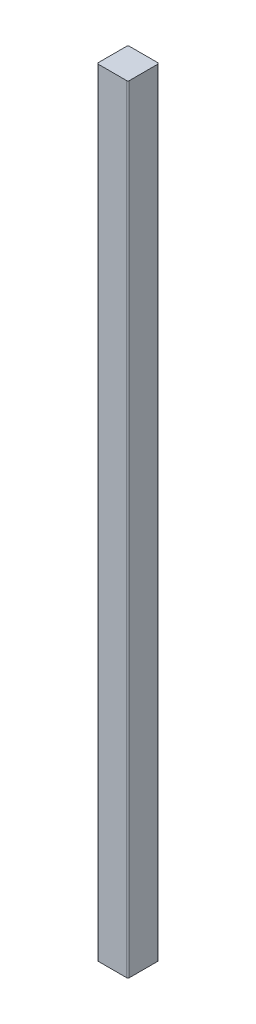
ISO-10303-21;
HEADER;
FILE_DESCRIPTION(('STEP AP214'),'2;1');
FILE_NAME('part.step','',(''),(''),'','','');
FILE_SCHEMA(('AUTOMOTIVE_DESIGN { 1 0 10303 214 1 1 1 1 }'));
ENDSEC;
DATA;
#1=APPLICATION_CONTEXT('core data for automotive mechanical design processes');
#2=APPLICATION_PROTOCOL_DEFINITION('international standard','automotive_design',2000,#1);
#3=PRODUCT_CONTEXT('',#1,'mechanical');
#4=PRODUCT('Part','Part','',(#3));
#5=PRODUCT_RELATED_PRODUCT_CATEGORY('part','',(#4));
#6=PRODUCT_DEFINITION_FORMATION('','',#4);
#7=PRODUCT_DEFINITION_CONTEXT('part definition',#1,'design');
#8=PRODUCT_DEFINITION('design','',#6,#7);
#9=PRODUCT_DEFINITION_SHAPE('','',#8);
#10=(LENGTH_UNIT() NAMED_UNIT(*) SI_UNIT(.MILLI.,.METRE.));
#11=(NAMED_UNIT(*) PLANE_ANGLE_UNIT() SI_UNIT($,.RADIAN.));
#12=(NAMED_UNIT(*) SI_UNIT($,.STERADIAN.) SOLID_ANGLE_UNIT());
#13=UNCERTAINTY_MEASURE_WITH_UNIT(LENGTH_MEASURE(1.E-05),#10,'distance_accuracy_value','');
#14=(GEOMETRIC_REPRESENTATION_CONTEXT(3) GLOBAL_UNCERTAINTY_ASSIGNED_CONTEXT((#13)) GLOBAL_UNIT_ASSIGNED_CONTEXT((#10,
#11,#12)) REPRESENTATION_CONTEXT('',''));
#15=CARTESIAN_POINT('',(0.,0.,0.));
#16=DIRECTION('',(0.,0.,1.));
#17=DIRECTION('',(1.,0.,0.));
#18=AXIS2_PLACEMENT_3D('',#15,#16,#17);
#19=CARTESIAN_POINT('',(-18.,1000.,18.));
#20=DIRECTION('',(0.,-1.,0.));
#21=DIRECTION('',(0.,0.,-1.));
#22=AXIS2_PLACEMENT_3D('',#19,#20,#21);
#23=CYLINDRICAL_SURFACE('',#22,2.);
#24=CARTESIAN_POINT('',(-18.,0.,18.));
#25=DIRECTION('',(0.,1.,0.));
#26=DIRECTION('',(0.,0.,1.));
#27=AXIS2_PLACEMENT_3D('',#24,#25,#26);
#28=CIRCLE('',#27,2.);
#29=CARTESIAN_POINT('',(-20.,0.,18.));
#30=VERTEX_POINT('',#29);
#31=CARTESIAN_POINT('',(-18.,0.,20.));
#32=VERTEX_POINT('',#31);
#33=EDGE_CURVE('E140',#30,#32,#28,.T.);
#34=ORIENTED_EDGE('',*,*,#33,.T.);
#35=DIRECTION('',(0.,-1.,0.));
#36=VECTOR('',#35,1.);
#37=CARTESIAN_POINT('',(-18.,1000.,20.));
#38=LINE('',#37,#36);
#39=CARTESIAN_POINT('',(-18.,1000.,20.));
#40=VERTEX_POINT('',#39);
#41=EDGE_CURVE('E11',#40,#32,#38,.T.);
#42=ORIENTED_EDGE('',*,*,#41,.F.);
#43=CARTESIAN_POINT('',(-18.,1000.,18.));
#44=DIRECTION('',(0.,1.,0.));
#45=DIRECTION('',(0.,0.,1.));
#46=AXIS2_PLACEMENT_3D('',#43,#44,#45);
#47=CIRCLE('',#46,2.);
#48=CARTESIAN_POINT('',(-20.,1000.,18.));
#49=VERTEX_POINT('',#48);
#50=EDGE_CURVE('E162',#49,#40,#47,.T.);
#51=ORIENTED_EDGE('',*,*,#50,.F.);
#52=DIRECTION('',(0.,-1.,0.));
#53=VECTOR('',#52,1.);
#54=CARTESIAN_POINT('',(-20.,1000.,18.));
#55=LINE('',#54,#53);
#56=EDGE_CURVE('E136',#49,#30,#55,.T.);
#57=ORIENTED_EDGE('',*,*,#56,.T.);
#58=EDGE_LOOP('',(#34,#42,#51,#57));
#59=FACE_BOUND('',#58,.T.);
#60=ADVANCED_FACE('F39',(#59),#23,.T.);
#61=CARTESIAN_POINT('',(-18.,1000.,20.));
#62=DIRECTION('',(0.,0.,-1.));
#63=DIRECTION('',(-1.,0.,0.));
#64=AXIS2_PLACEMENT_3D('',#61,#62,#63);
#65=PLANE('',#64);
#66=DIRECTION('',(1.,0.,0.));
#67=VECTOR('',#66,1.);
#68=CARTESIAN_POINT('',(-18.,0.,20.));
#69=LINE('',#68,#67);
#70=CARTESIAN_POINT('',(18.,0.,20.));
#71=VERTEX_POINT('',#70);
#72=EDGE_CURVE('E144',#32,#71,#69,.T.);
#73=ORIENTED_EDGE('',*,*,#72,.T.);
#74=DIRECTION('',(0.,-1.,0.));
#75=VECTOR('',#74,1.);
#76=CARTESIAN_POINT('',(18.,1000.,20.));
#77=LINE('',#76,#75);
#78=CARTESIAN_POINT('',(18.,1000.,20.));
#79=VERTEX_POINT('',#78);
#80=EDGE_CURVE('E48',#79,#71,#77,.T.);
#81=ORIENTED_EDGE('',*,*,#80,.F.);
#82=DIRECTION('',(1.,0.,0.));
#83=VECTOR('',#82,1.);
#84=CARTESIAN_POINT('',(-18.,1000.,20.));
#85=LINE('',#84,#83);
#86=EDGE_CURVE('E99',#40,#79,#85,.T.);
#87=ORIENTED_EDGE('',*,*,#86,.F.);
#88=ORIENTED_EDGE('',*,*,#41,.T.);
#89=EDGE_LOOP('',(#73,#81,#87,#88));
#90=FACE_BOUND('',#89,.T.);
#91=ADVANCED_FACE('F208',(#90),#65,.F.);
#92=CARTESIAN_POINT('',(18.,1000.,18.));
#93=DIRECTION('',(0.,-1.,0.));
#94=DIRECTION('',(0.,0.,-1.));
#95=AXIS2_PLACEMENT_3D('',#92,#93,#94);
#96=CYLINDRICAL_SURFACE('',#95,2.);
#97=CARTESIAN_POINT('',(18.,0.,18.));
#98=DIRECTION('',(0.,1.,0.));
#99=DIRECTION('',(0.,0.,1.));
#100=AXIS2_PLACEMENT_3D('',#97,#98,#99);
#101=CIRCLE('',#100,2.);
#102=CARTESIAN_POINT('',(20.,0.,18.));
#103=VERTEX_POINT('',#102);
#104=EDGE_CURVE('E147',#71,#103,#101,.T.);
#105=ORIENTED_EDGE('',*,*,#104,.T.);
#106=DIRECTION('',(0.,-1.,0.));
#107=VECTOR('',#106,1.);
#108=CARTESIAN_POINT('',(20.,1000.,18.));
#109=LINE('',#108,#107);
#110=CARTESIAN_POINT('',(20.,1000.,18.));
#111=VERTEX_POINT('',#110);
#112=EDGE_CURVE('E173',#111,#103,#109,.T.);
#113=ORIENTED_EDGE('',*,*,#112,.F.);
#114=CARTESIAN_POINT('',(18.,1000.,18.));
#115=DIRECTION('',(0.,1.,0.));
#116=DIRECTION('',(0.,0.,1.));
#117=AXIS2_PLACEMENT_3D('',#114,#115,#116);
#118=CIRCLE('',#117,2.);
#119=EDGE_CURVE('E183',#79,#111,#118,.T.);
#120=ORIENTED_EDGE('',*,*,#119,.F.);
#121=ORIENTED_EDGE('',*,*,#80,.T.);
#122=EDGE_LOOP('',(#105,#113,#120,#121));
#123=FACE_BOUND('',#122,.T.);
#124=ADVANCED_FACE('F181',(#123),#96,.T.);
#125=CARTESIAN_POINT('',(20.,1000.,-18.));
#126=DIRECTION('',(-1.,0.,0.));
#127=DIRECTION('',(0.,0.,1.));
#128=AXIS2_PLACEMENT_3D('',#125,#126,#127);
#129=PLANE('',#128);
#130=DIRECTION('',(0.,0.,-1.));
#131=VECTOR('',#130,1.);
#132=CARTESIAN_POINT('',(20.,0.,-18.));
#133=LINE('',#132,#131);
#134=CARTESIAN_POINT('',(20.,0.,-18.));
#135=VERTEX_POINT('',#134);
#136=EDGE_CURVE('E150',#103,#135,#133,.T.);
#137=ORIENTED_EDGE('',*,*,#136,.T.);
#138=DIRECTION('',(0.,-1.,0.));
#139=VECTOR('',#138,1.);
#140=CARTESIAN_POINT('',(20.,1000.,-18.));
#141=LINE('',#140,#139);
#142=CARTESIAN_POINT('',(20.,1000.,-18.));
#143=VERTEX_POINT('',#142);
#144=EDGE_CURVE('E169',#143,#135,#141,.T.);
#145=ORIENTED_EDGE('',*,*,#144,.F.);
#146=DIRECTION('',(0.,0.,-1.));
#147=VECTOR('',#146,1.);
#148=CARTESIAN_POINT('',(20.,1000.,-18.));
#149=LINE('',#148,#147);
#150=EDGE_CURVE('E196',#111,#143,#149,.T.);
#151=ORIENTED_EDGE('',*,*,#150,.F.);
#152=ORIENTED_EDGE('',*,*,#112,.T.);
#153=EDGE_LOOP('',(#137,#145,#151,#152));
#154=FACE_BOUND('',#153,.T.);
#155=ADVANCED_FACE('F191',(#154),#129,.F.);
#156=CARTESIAN_POINT('',(18.,1000.,-18.));
#157=DIRECTION('',(0.,-1.,0.));
#158=DIRECTION('',(0.,0.,-1.));
#159=AXIS2_PLACEMENT_3D('',#156,#157,#158);
#160=CYLINDRICAL_SURFACE('',#159,2.);
#161=CARTESIAN_POINT('',(18.,0.,-18.));
#162=DIRECTION('',(0.,1.,0.));
#163=DIRECTION('',(0.,0.,-1.));
#164=AXIS2_PLACEMENT_3D('',#161,#162,#163);
#165=CIRCLE('',#164,2.);
#166=CARTESIAN_POINT('',(18.,0.,-20.));
#167=VERTEX_POINT('',#166);
#168=EDGE_CURVE('E153',#135,#167,#165,.T.);
#169=ORIENTED_EDGE('',*,*,#168,.T.);
#170=DIRECTION('',(0.,-1.,0.));
#171=VECTOR('',#170,1.);
#172=CARTESIAN_POINT('',(18.,1000.,-20.));
#173=LINE('',#172,#171);
#174=CARTESIAN_POINT('',(18.,1000.,-20.));
#175=VERTEX_POINT('',#174);
#176=EDGE_CURVE('E129',#175,#167,#173,.T.);
#177=ORIENTED_EDGE('',*,*,#176,.F.);
#178=CARTESIAN_POINT('',(18.,1000.,-18.));
#179=DIRECTION('',(0.,1.,0.));
#180=DIRECTION('',(0.,0.,-1.));
#181=AXIS2_PLACEMENT_3D('',#178,#179,#180);
#182=CIRCLE('',#181,2.);
#183=EDGE_CURVE('E118',#143,#175,#182,.T.);
#184=ORIENTED_EDGE('',*,*,#183,.F.);
#185=ORIENTED_EDGE('',*,*,#144,.T.);
#186=EDGE_LOOP('',(#169,#177,#184,#185));
#187=FACE_BOUND('',#186,.T.);
#188=ADVANCED_FACE('F194',(#187),#160,.T.);
#189=CARTESIAN_POINT('',(-18.,1000.,-20.));
#190=DIRECTION('',(0.,0.,1.));
#191=DIRECTION('',(1.,0.,0.));
#192=AXIS2_PLACEMENT_3D('',#189,#190,#191);
#193=PLANE('',#192);
#194=DIRECTION('',(-1.,0.,0.));
#195=VECTOR('',#194,1.);
#196=CARTESIAN_POINT('',(-18.,0.,-20.));
#197=LINE('',#196,#195);
#198=CARTESIAN_POINT('',(-18.,0.,-20.));
#199=VERTEX_POINT('',#198);
#200=EDGE_CURVE('E127',#167,#199,#197,.T.);
#201=ORIENTED_EDGE('',*,*,#200,.T.);
#202=DIRECTION('',(0.,-1.,0.));
#203=VECTOR('',#202,1.);
#204=CARTESIAN_POINT('',(-18.,1000.,-20.));
#205=LINE('',#204,#203);
#206=CARTESIAN_POINT('',(-18.,1000.,-20.));
#207=VERTEX_POINT('',#206);
#208=EDGE_CURVE('E124',#207,#199,#205,.T.);
#209=ORIENTED_EDGE('',*,*,#208,.F.);
#210=DIRECTION('',(-1.,0.,0.));
#211=VECTOR('',#210,1.);
#212=CARTESIAN_POINT('',(-18.,1000.,-20.));
#213=LINE('',#212,#211);
#214=EDGE_CURVE('E112',#175,#207,#213,.T.);
#215=ORIENTED_EDGE('',*,*,#214,.F.);
#216=ORIENTED_EDGE('',*,*,#176,.T.);
#217=EDGE_LOOP('',(#201,#209,#215,#216));
#218=FACE_BOUND('',#217,.T.);
#219=ADVANCED_FACE('F125',(#218),#193,.F.);
#220=CARTESIAN_POINT('',(-18.,1000.,-18.));
#221=DIRECTION('',(0.,-1.,0.));
#222=DIRECTION('',(0.,0.,-1.));
#223=AXIS2_PLACEMENT_3D('',#220,#221,#222);
#224=CYLINDRICAL_SURFACE('',#223,2.);
#225=CARTESIAN_POINT('',(-18.,0.,-18.));
#226=DIRECTION('',(0.,1.,0.));
#227=DIRECTION('',(0.,0.,1.));
#228=AXIS2_PLACEMENT_3D('',#225,#226,#227);
#229=CIRCLE('',#228,2.);
#230=CARTESIAN_POINT('',(-20.,0.,-18.));
#231=VERTEX_POINT('',#230);
#232=EDGE_CURVE('E85',#199,#231,#229,.T.);
#233=ORIENTED_EDGE('',*,*,#232,.T.);
#234=DIRECTION('',(0.,-1.,0.));
#235=VECTOR('',#234,1.);
#236=CARTESIAN_POINT('',(-20.,1000.,-18.));
#237=LINE('',#236,#235);
#238=CARTESIAN_POINT('',(-20.,1000.,-18.));
#239=VERTEX_POINT('',#238);
#240=EDGE_CURVE('E130',#239,#231,#237,.T.);
#241=ORIENTED_EDGE('',*,*,#240,.F.);
#242=CARTESIAN_POINT('',(-18.,1000.,-18.));
#243=DIRECTION('',(0.,1.,0.));
#244=DIRECTION('',(0.,0.,1.));
#245=AXIS2_PLACEMENT_3D('',#242,#243,#244);
#246=CIRCLE('',#245,2.);
#247=EDGE_CURVE('E116',#207,#239,#246,.T.);
#248=ORIENTED_EDGE('',*,*,#247,.F.);
#249=ORIENTED_EDGE('',*,*,#208,.T.);
#250=EDGE_LOOP('',(#233,#241,#248,#249));
#251=FACE_BOUND('',#250,.T.);
#252=ADVANCED_FACE('F132',(#251),#224,.T.);
#253=CARTESIAN_POINT('',(-20.,1000.,-18.));
#254=DIRECTION('',(1.,0.,0.));
#255=DIRECTION('',(0.,0.,-1.));
#256=AXIS2_PLACEMENT_3D('',#253,#254,#255);
#257=PLANE('',#256);
#258=DIRECTION('',(0.,0.,1.));
#259=VECTOR('',#258,1.);
#260=CARTESIAN_POINT('',(-20.,0.,-18.));
#261=LINE('',#260,#259);
#262=EDGE_CURVE('E91',#231,#30,#261,.T.);
#263=ORIENTED_EDGE('',*,*,#262,.T.);
#264=ORIENTED_EDGE('',*,*,#56,.F.);
#265=DIRECTION('',(0.,0.,1.));
#266=VECTOR('',#265,1.);
#267=CARTESIAN_POINT('',(-20.,1000.,-18.));
#268=LINE('',#267,#266);
#269=EDGE_CURVE('E56',#239,#49,#268,.T.);
#270=ORIENTED_EDGE('',*,*,#269,.F.);
#271=ORIENTED_EDGE('',*,*,#240,.T.);
#272=EDGE_LOOP('',(#263,#264,#270,#271));
#273=FACE_BOUND('',#272,.T.);
#274=ADVANCED_FACE('F224',(#273),#257,.F.);
#275=CARTESIAN_POINT('',(-18.,1000.,18.));
#276=DIRECTION('',(0.,1.,0.));
#277=DIRECTION('',(0.,0.,1.));
#278=AXIS2_PLACEMENT_3D('',#275,#276,#277);
#279=PLANE('',#278);
#280=ORIENTED_EDGE('',*,*,#50,.T.);
#281=ORIENTED_EDGE('',*,*,#86,.T.);
#282=ORIENTED_EDGE('',*,*,#119,.T.);
#283=ORIENTED_EDGE('',*,*,#150,.T.);
#284=ORIENTED_EDGE('',*,*,#183,.T.);
#285=ORIENTED_EDGE('',*,*,#214,.T.);
#286=ORIENTED_EDGE('',*,*,#247,.T.);
#287=ORIENTED_EDGE('',*,*,#269,.T.);
#288=EDGE_LOOP('',(#280,#281,#282,#283,#284,#285,#286,#287));
#289=FACE_BOUND('',#288,.T.);
#290=ADVANCED_FACE('F114',(#289),#279,.T.);
#291=CARTESIAN_POINT('',(-18.,0.,18.));
#292=DIRECTION('',(0.,1.,0.));
#293=DIRECTION('',(0.,0.,1.));
#294=AXIS2_PLACEMENT_3D('',#291,#292,#293);
#295=PLANE('',#294);
#296=ORIENTED_EDGE('',*,*,#33,.F.);
#297=ORIENTED_EDGE('',*,*,#262,.F.);
#298=ORIENTED_EDGE('',*,*,#232,.F.);
#299=ORIENTED_EDGE('',*,*,#200,.F.);
#300=ORIENTED_EDGE('',*,*,#168,.F.);
#301=ORIENTED_EDGE('',*,*,#136,.F.);
#302=ORIENTED_EDGE('',*,*,#104,.F.);
#303=ORIENTED_EDGE('',*,*,#72,.F.);
#304=EDGE_LOOP('',(#296,#297,#298,#299,#300,#301,#302,#303));
#305=FACE_BOUND('',#304,.T.);
#306=ADVANCED_FACE('F187',(#305),#295,.F.);
#307=CLOSED_SHELL('',(#60,#91,#124,#155,#188,#219,#252,#274,#290,#306));
#308=MANIFOLD_SOLID_BREP('B2',#307);
#309=ADVANCED_BREP_SHAPE_REPRESENTATION('',(#18,#308),#14);
#310=SHAPE_DEFINITION_REPRESENTATION(#9,#309);
ENDSEC;
END-ISO-10303-21;
